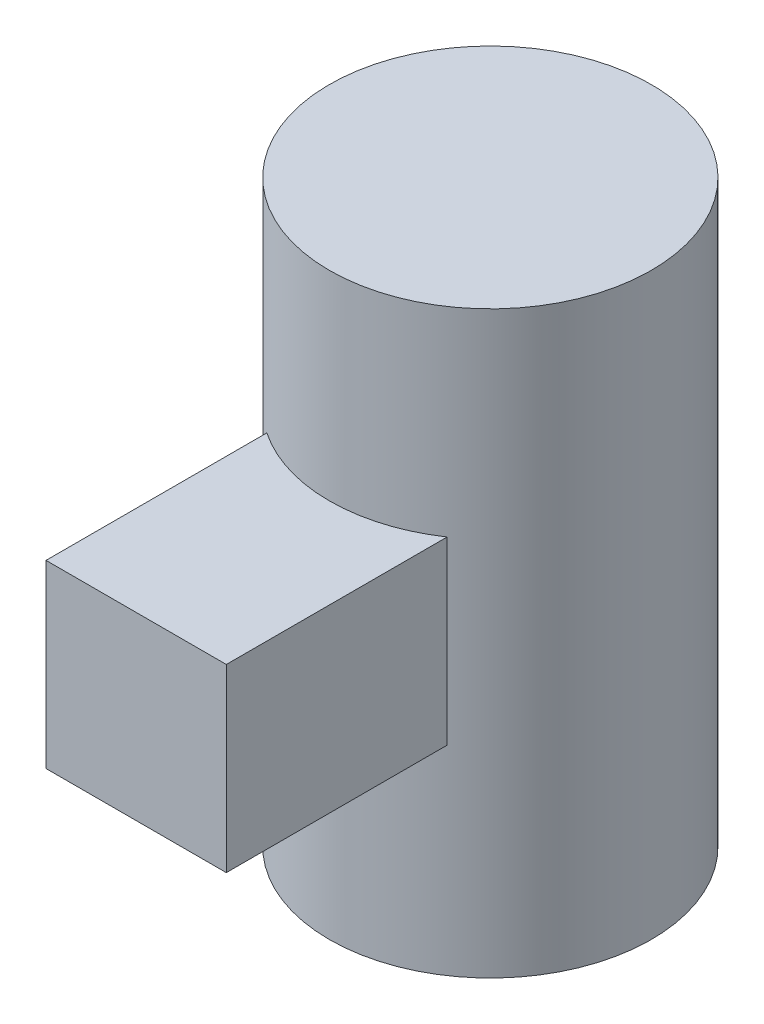
ISO-10303-21;
HEADER;
FILE_DESCRIPTION(('STEP AP214'),'2;1');
FILE_NAME('part.step','',(''),(''),'','','');
FILE_SCHEMA(('AUTOMOTIVE_DESIGN { 1 0 10303 214 1 1 1 1 }'));
ENDSEC;
DATA;
#1=APPLICATION_CONTEXT('core data for automotive mechanical design processes');
#2=APPLICATION_PROTOCOL_DEFINITION('international standard','automotive_design',2000,#1);
#3=PRODUCT_CONTEXT('',#1,'mechanical');
#4=PRODUCT('Part','Part','',(#3));
#5=PRODUCT_RELATED_PRODUCT_CATEGORY('part','',(#4));
#6=PRODUCT_DEFINITION_FORMATION('','',#4);
#7=PRODUCT_DEFINITION_CONTEXT('part definition',#1,'design');
#8=PRODUCT_DEFINITION('design','',#6,#7);
#9=PRODUCT_DEFINITION_SHAPE('','',#8);
#10=(LENGTH_UNIT() NAMED_UNIT(*) SI_UNIT(.MILLI.,.METRE.));
#11=(NAMED_UNIT(*) PLANE_ANGLE_UNIT() SI_UNIT($,.RADIAN.));
#12=(NAMED_UNIT(*) SI_UNIT($,.STERADIAN.) SOLID_ANGLE_UNIT());
#13=UNCERTAINTY_MEASURE_WITH_UNIT(LENGTH_MEASURE(1.E-05),#10,'distance_accuracy_value','');
#14=(GEOMETRIC_REPRESENTATION_CONTEXT(3) GLOBAL_UNCERTAINTY_ASSIGNED_CONTEXT((#13)) GLOBAL_UNIT_ASSIGNED_CONTEXT((#10,
#11,#12)) REPRESENTATION_CONTEXT('',''));
#15=CARTESIAN_POINT('',(0.,0.,0.));
#16=DIRECTION('',(0.,0.,1.));
#17=DIRECTION('',(1.,0.,0.));
#18=AXIS2_PLACEMENT_3D('',#15,#16,#17);
#19=CARTESIAN_POINT('',(0.,57.15,0.));
#20=DIRECTION('',(0.,-1.,0.));
#21=DIRECTION('',(0.,0.,-1.));
#22=AXIS2_PLACEMENT_3D('',#19,#20,#21);
#23=CYLINDRICAL_SURFACE('',#22,31.75);
#24=CARTESIAN_POINT('',(0.,-57.15,0.));
#25=DIRECTION('',(0.,1.,0.));
#26=DIRECTION('',(0.,0.,1.));
#27=AXIS2_PLACEMENT_3D('',#24,#25,#26);
#28=CIRCLE('',#27,31.75);
#29=CARTESIAN_POINT('',(0.,-57.15,31.75));
#30=VERTEX_POINT('',#29);
#31=EDGE_CURVE('E98',#30,#30,#28,.T.);
#32=ORIENTED_EDGE('',*,*,#31,.T.);
#33=EDGE_LOOP('',(#32));
#34=FACE_BOUND('',#33,.T.);
#35=CARTESIAN_POINT('',(0.,57.15,0.));
#36=DIRECTION('',(0.,1.,0.));
#37=DIRECTION('',(0.,0.,1.));
#38=AXIS2_PLACEMENT_3D('',#35,#36,#37);
#39=CIRCLE('',#38,31.75);
#40=CARTESIAN_POINT('',(0.,57.15,31.75));
#41=VERTEX_POINT('',#40);
#42=EDGE_CURVE('E101',#41,#41,#39,.T.);
#43=ORIENTED_EDGE('',*,*,#42,.F.);
#44=EDGE_LOOP('',(#43));
#45=FACE_BOUND('',#44,.T.);
#46=DIRECTION('',(0.,-1.,0.));
#47=VECTOR('',#46,1.);
#48=CARTESIAN_POINT('',(17.78,57.15,26.3046402750541));
#49=LINE('',#48,#47);
#50=CARTESIAN_POINT('',(17.78,-17.78,26.3046402750541));
#51=VERTEX_POINT('',#50);
#52=CARTESIAN_POINT('',(17.78,17.78,26.3046402750541));
#53=VERTEX_POINT('',#52);
#54=EDGE_CURVE('E11',#51,#53,#49,.F.);
#55=ORIENTED_EDGE('',*,*,#54,.F.);
#56=CARTESIAN_POINT('',(0.,-17.78,0.));
#57=DIRECTION('',(0.,1.,0.));
#58=DIRECTION('',(0.,0.,1.));
#59=AXIS2_PLACEMENT_3D('',#56,#57,#58);
#60=CIRCLE('',#59,31.75);
#61=CARTESIAN_POINT('',(-17.78,-17.78,26.3046402750541));
#62=VERTEX_POINT('',#61);
#63=EDGE_CURVE('E108',#62,#51,#60,.T.);
#64=ORIENTED_EDGE('',*,*,#63,.F.);
#65=DIRECTION('',(0.,-1.,0.));
#66=VECTOR('',#65,1.);
#67=CARTESIAN_POINT('',(-17.78,57.15,26.3046402750541));
#68=LINE('',#67,#66);
#69=CARTESIAN_POINT('',(-17.78,17.78,26.3046402750541));
#70=VERTEX_POINT('',#69);
#71=EDGE_CURVE('E58',#70,#62,#68,.T.);
#72=ORIENTED_EDGE('',*,*,#71,.F.);
#73=CARTESIAN_POINT('',(0.,17.78,0.));
#74=DIRECTION('',(0.,-1.,0.));
#75=DIRECTION('',(0.,0.,-1.));
#76=AXIS2_PLACEMENT_3D('',#73,#74,#75);
#77=CIRCLE('',#76,31.75);
#78=EDGE_CURVE('E48',#53,#70,#77,.T.);
#79=ORIENTED_EDGE('',*,*,#78,.F.);
#80=EDGE_LOOP('',(#55,#64,#72,#79));
#81=FACE_BOUND('',#80,.T.);
#82=ADVANCED_FACE('F41',(#34,#45,#81),#23,.T.);
#83=CARTESIAN_POINT('',(0.,57.15,0.));
#84=DIRECTION('',(0.,1.,0.));
#85=DIRECTION('',(0.,0.,1.));
#86=AXIS2_PLACEMENT_3D('',#83,#84,#85);
#87=PLANE('',#86);
#88=ORIENTED_EDGE('',*,*,#42,.T.);
#89=EDGE_LOOP('',(#88));
#90=FACE_BOUND('',#89,.T.);
#91=ADVANCED_FACE('F123',(#90),#87,.T.);
#92=CARTESIAN_POINT('',(0.,-57.15,0.));
#93=DIRECTION('',(0.,1.,0.));
#94=DIRECTION('',(0.,0.,1.));
#95=AXIS2_PLACEMENT_3D('',#92,#93,#94);
#96=PLANE('',#95);
#97=ORIENTED_EDGE('',*,*,#31,.F.);
#98=EDGE_LOOP('',(#97));
#99=FACE_BOUND('',#98,.T.);
#100=ADVANCED_FACE('F128',(#99),#96,.F.);
#101=CARTESIAN_POINT('',(17.78,-17.78,69.85));
#102=DIRECTION('',(-1.,0.,0.));
#103=DIRECTION('',(0.,0.,1.));
#104=AXIS2_PLACEMENT_3D('',#101,#102,#103);
#105=PLANE('',#104);
#106=DIRECTION('',(0.,0.,-1.));
#107=VECTOR('',#106,1.);
#108=CARTESIAN_POINT('',(17.78,-17.78,69.85));
#109=LINE('',#108,#107);
#110=CARTESIAN_POINT('',(17.78,-17.78,69.85));
#111=VERTEX_POINT('',#110);
#112=EDGE_CURVE('E117',#111,#51,#109,.T.);
#113=ORIENTED_EDGE('',*,*,#112,.T.);
#114=ORIENTED_EDGE('',*,*,#54,.T.);
#115=DIRECTION('',(0.,0.,-1.));
#116=VECTOR('',#115,1.);
#117=CARTESIAN_POINT('',(17.78,17.78,69.85));
#118=LINE('',#117,#116);
#119=CARTESIAN_POINT('',(17.78,17.78,69.85));
#120=VERTEX_POINT('',#119);
#121=EDGE_CURVE('E81',#120,#53,#118,.T.);
#122=ORIENTED_EDGE('',*,*,#121,.F.);
#123=DIRECTION('',(0.,1.,0.));
#124=VECTOR('',#123,1.);
#125=CARTESIAN_POINT('',(17.78,-17.78,69.85));
#126=LINE('',#125,#124);
#127=EDGE_CURVE('E87',#111,#120,#126,.T.);
#128=ORIENTED_EDGE('',*,*,#127,.F.);
#129=EDGE_LOOP('',(#113,#114,#122,#128));
#130=FACE_BOUND('',#129,.T.);
#131=ADVANCED_FACE('F97',(#130),#105,.F.);
#132=CARTESIAN_POINT('',(-17.78,-17.78,69.85));
#133=DIRECTION('',(1.,0.,0.));
#134=DIRECTION('',(0.,0.,-1.));
#135=AXIS2_PLACEMENT_3D('',#132,#133,#134);
#136=PLANE('',#135);
#137=DIRECTION('',(0.,0.,-1.));
#138=VECTOR('',#137,1.);
#139=CARTESIAN_POINT('',(-17.78,17.78,69.85));
#140=LINE('',#139,#138);
#141=CARTESIAN_POINT('',(-17.78,17.78,69.85));
#142=VERTEX_POINT('',#141);
#143=EDGE_CURVE('E83',#142,#70,#140,.T.);
#144=ORIENTED_EDGE('',*,*,#143,.T.);
#145=ORIENTED_EDGE('',*,*,#71,.T.);
#146=DIRECTION('',(0.,0.,-1.));
#147=VECTOR('',#146,1.);
#148=CARTESIAN_POINT('',(-17.78,-17.78,69.85));
#149=LINE('',#148,#147);
#150=CARTESIAN_POINT('',(-17.78,-17.78,69.85));
#151=VERTEX_POINT('',#150);
#152=EDGE_CURVE('E103',#151,#62,#149,.T.);
#153=ORIENTED_EDGE('',*,*,#152,.F.);
#154=DIRECTION('',(0.,-1.,0.));
#155=VECTOR('',#154,1.);
#156=CARTESIAN_POINT('',(-17.78,-17.78,69.85));
#157=LINE('',#156,#155);
#158=EDGE_CURVE('E86',#142,#151,#157,.T.);
#159=ORIENTED_EDGE('',*,*,#158,.F.);
#160=EDGE_LOOP('',(#144,#145,#153,#159));
#161=FACE_BOUND('',#160,.T.);
#162=ADVANCED_FACE('F113',(#161),#136,.F.);
#163=CARTESIAN_POINT('',(-17.78,17.78,69.85));
#164=DIRECTION('',(0.,-1.,0.));
#165=DIRECTION('',(0.,0.,-1.));
#166=AXIS2_PLACEMENT_3D('',#163,#164,#165);
#167=PLANE('',#166);
#168=ORIENTED_EDGE('',*,*,#121,.T.);
#169=ORIENTED_EDGE('',*,*,#78,.T.);
#170=ORIENTED_EDGE('',*,*,#143,.F.);
#171=DIRECTION('',(-1.,0.,0.));
#172=VECTOR('',#171,1.);
#173=CARTESIAN_POINT('',(-17.78,17.78,69.85));
#174=LINE('',#173,#172);
#175=EDGE_CURVE('E77',#120,#142,#174,.T.);
#176=ORIENTED_EDGE('',*,*,#175,.F.);
#177=EDGE_LOOP('',(#168,#169,#170,#176));
#178=FACE_BOUND('',#177,.T.);
#179=ADVANCED_FACE('F79',(#178),#167,.F.);
#180=CARTESIAN_POINT('',(-17.78,-17.78,69.85));
#181=DIRECTION('',(0.,1.,0.));
#182=DIRECTION('',(0.,0.,1.));
#183=AXIS2_PLACEMENT_3D('',#180,#181,#182);
#184=PLANE('',#183);
#185=ORIENTED_EDGE('',*,*,#152,.T.);
#186=ORIENTED_EDGE('',*,*,#63,.T.);
#187=ORIENTED_EDGE('',*,*,#112,.F.);
#188=DIRECTION('',(1.,0.,0.));
#189=VECTOR('',#188,1.);
#190=CARTESIAN_POINT('',(-17.78,-17.78,69.85));
#191=LINE('',#190,#189);
#192=EDGE_CURVE('E92',#151,#111,#191,.T.);
#193=ORIENTED_EDGE('',*,*,#192,.F.);
#194=EDGE_LOOP('',(#185,#186,#187,#193));
#195=FACE_BOUND('',#194,.T.);
#196=ADVANCED_FACE('F121',(#195),#184,.F.);
#197=CARTESIAN_POINT('',(0.,0.,69.85));
#198=DIRECTION('',(0.,0.,-1.));
#199=DIRECTION('',(-1.,0.,0.));
#200=AXIS2_PLACEMENT_3D('',#197,#198,#199);
#201=PLANE('',#200);
#202=ORIENTED_EDGE('',*,*,#127,.T.);
#203=ORIENTED_EDGE('',*,*,#175,.T.);
#204=ORIENTED_EDGE('',*,*,#158,.T.);
#205=ORIENTED_EDGE('',*,*,#192,.T.);
#206=EDGE_LOOP('',(#202,#203,#204,#205));
#207=FACE_BOUND('',#206,.T.);
#208=ADVANCED_FACE('F90',(#207),#201,.F.);
#209=CLOSED_SHELL('',(#82,#91,#100,#131,#162,#179,#196,#208));
#210=MANIFOLD_SOLID_BREP('B2',#209);
#211=ADVANCED_BREP_SHAPE_REPRESENTATION('',(#18,#210),#14);
#212=SHAPE_DEFINITION_REPRESENTATION(#9,#211);
ENDSEC;
END-ISO-10303-21;
